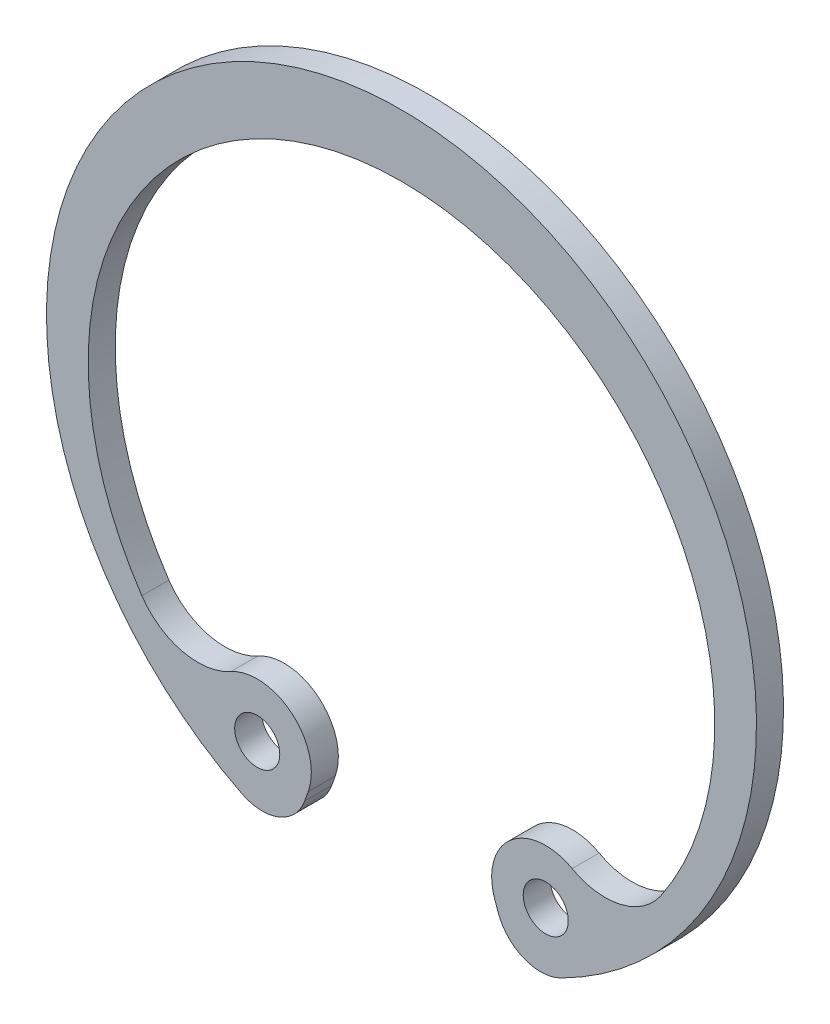
ISO-10303-21;
HEADER;
FILE_DESCRIPTION(('STEP AP214'),'2;1');
FILE_NAME('part.step','',(''),(''),'','','');
FILE_SCHEMA(('AUTOMOTIVE_DESIGN { 1 0 10303 214 1 1 1 1 }'));
ENDSEC;
DATA;
#1=APPLICATION_CONTEXT('core data for automotive mechanical design processes');
#2=APPLICATION_PROTOCOL_DEFINITION('international standard','automotive_design',2000,#1);
#3=PRODUCT_CONTEXT('',#1,'mechanical');
#4=PRODUCT('Part','Part','',(#3));
#5=PRODUCT_RELATED_PRODUCT_CATEGORY('part','',(#4));
#6=PRODUCT_DEFINITION_FORMATION('','',#4);
#7=PRODUCT_DEFINITION_CONTEXT('part definition',#1,'design');
#8=PRODUCT_DEFINITION('design','',#6,#7);
#9=PRODUCT_DEFINITION_SHAPE('','',#8);
#10=(LENGTH_UNIT() NAMED_UNIT(*) SI_UNIT(.MILLI.,.METRE.));
#11=(NAMED_UNIT(*) PLANE_ANGLE_UNIT() SI_UNIT($,.RADIAN.));
#12=(NAMED_UNIT(*) SI_UNIT($,.STERADIAN.) SOLID_ANGLE_UNIT());
#13=UNCERTAINTY_MEASURE_WITH_UNIT(LENGTH_MEASURE(1.E-05),#10,'distance_accuracy_value','');
#14=(GEOMETRIC_REPRESENTATION_CONTEXT(3) GLOBAL_UNCERTAINTY_ASSIGNED_CONTEXT((#13)) GLOBAL_UNIT_ASSIGNED_CONTEXT((#10,
#11,#12)) REPRESENTATION_CONTEXT('',''));
#15=CARTESIAN_POINT('',(0.,0.,0.));
#16=DIRECTION('',(0.,0.,1.));
#17=DIRECTION('',(1.,0.,0.));
#18=AXIS2_PLACEMENT_3D('',#15,#16,#17);
#19=CARTESIAN_POINT('',(-6.17774308325366,-11.384054314326,1.2));
#20=DIRECTION('',(0.,0.,1.));
#21=DIRECTION('',(1.,0.,0.));
#22=AXIS2_PLACEMENT_3D('',#19,#20,#21);
#23=PLANE('',#22);
#24=CARTESIAN_POINT('',(-6.4,-10.8159079887135,1.2));
#25=DIRECTION('',(0.,0.,1.));
#26=DIRECTION('',(1.,0.,0.));
#27=AXIS2_PLACEMENT_3D('',#24,#25,#26);
#28=CIRCLE('',#27,1.);
#29=CARTESIAN_POINT('',(-5.4,-10.8159079887135,1.2));
#30=VERTEX_POINT('',#29);
#31=EDGE_CURVE('E145',#30,#30,#28,.T.);
#32=ORIENTED_EDGE('',*,*,#31,.F.);
#33=EDGE_LOOP('',(#32));
#34=FACE_BOUND('',#33,.T.);
#35=CARTESIAN_POINT('',(-6.17774308325366,-11.384054314326,1.2));
#36=DIRECTION('',(0.,0.,1.));
#37=DIRECTION('',(1.,0.,0.));
#38=AXIS2_PLACEMENT_3D('',#35,#36,#37);
#39=CIRCLE('',#38,2.);
#40=CARTESIAN_POINT('',(-7.07632389536327,-13.1708258509553,1.2));
#41=VERTEX_POINT('',#40);
#42=CARTESIAN_POINT('',(-4.29368008749084,-12.0551032156717,1.2));
#43=VERTEX_POINT('',#42);
#44=EDGE_CURVE('E160',#41,#43,#39,.T.);
#45=ORIENTED_EDGE('',*,*,#44,.T.);
#46=DIRECTION('',(0.335524450672834,0.94203149788141,0.));
#47=VECTOR('',#46,1.);
#48=CARTESIAN_POINT('',(-4.13912440508462,-11.6211666703283,1.2));
#49=LINE('',#48,#47);
#50=CARTESIAN_POINT('',(-4.13912440508462,-11.6211666703283,1.2));
#51=VERTEX_POINT('',#50);
#52=EDGE_CURVE('E98',#43,#51,#49,.T.);
#53=ORIENTED_EDGE('',*,*,#52,.T.);
#54=CARTESIAN_POINT('',(-6.4,-10.8159079887135,1.2));
#55=DIRECTION('',(0.,0.,1.));
#56=DIRECTION('',(1.,0.,0.));
#57=AXIS2_PLACEMENT_3D('',#54,#55,#56);
#58=CIRCLE('',#57,2.4);
#59=CARTESIAN_POINT('',(-7.57002157304939,-8.72042486575613,1.2));
#60=VERTEX_POINT('',#59);
#61=EDGE_CURVE('E181',#51,#60,#58,.T.);
#62=ORIENTED_EDGE('',*,*,#61,.T.);
#63=CARTESIAN_POINT('',(-9.03254853936113,-6.10107096205946,1.2));
#64=DIRECTION('',(0.,0.,-1.));
#65=DIRECTION('',(1.,0.,0.));
#66=AXIS2_PLACEMENT_3D('',#63,#64,#65);
#67=CIRCLE('',#66,3.);
#68=CARTESIAN_POINT('',(-11.5185710731303,-7.78026480482811,1.2));
#69=VERTEX_POINT('',#68);
#70=EDGE_CURVE('E200',#60,#69,#67,.T.);
#71=ORIENTED_EDGE('',*,*,#70,.T.);
#72=CARTESIAN_POINT('',(0.,0.,1.2));
#73=DIRECTION('',(0.,0.,-1.));
#74=DIRECTION('',(1.,0.,0.));
#75=AXIS2_PLACEMENT_3D('',#72,#73,#74);
#76=CIRCLE('',#75,13.9);
#77=CARTESIAN_POINT('',(11.5185710731302,-7.78026480482812,1.2));
#78=VERTEX_POINT('',#77);
#79=EDGE_CURVE('E197',#69,#78,#76,.T.);
#80=ORIENTED_EDGE('',*,*,#79,.T.);
#81=CARTESIAN_POINT('',(9.03254853936113,-6.10107096205946,1.2));
#82=DIRECTION('',(0.,0.,-1.));
#83=DIRECTION('',(-1.,0.,0.));
#84=AXIS2_PLACEMENT_3D('',#81,#82,#83);
#85=CIRCLE('',#84,3.);
#86=CARTESIAN_POINT('',(7.57002157304939,-8.72042486575613,1.2));
#87=VERTEX_POINT('',#86);
#88=EDGE_CURVE('E199',#78,#87,#85,.T.);
#89=ORIENTED_EDGE('',*,*,#88,.T.);
#90=CARTESIAN_POINT('',(6.4,-10.8159079887135,1.2));
#91=DIRECTION('',(0.,0.,1.));
#92=DIRECTION('',(-1.,0.,0.));
#93=AXIS2_PLACEMENT_3D('',#90,#91,#92);
#94=CIRCLE('',#93,2.4);
#95=CARTESIAN_POINT('',(4.13912440508462,-11.6211666703283,1.2));
#96=VERTEX_POINT('',#95);
#97=EDGE_CURVE('E123',#87,#96,#94,.T.);
#98=ORIENTED_EDGE('',*,*,#97,.T.);
#99=DIRECTION('',(0.335524450672839,-0.942031497881408,0.));
#100=VECTOR('',#99,1.);
#101=CARTESIAN_POINT('',(4.13912440508462,-11.6211666703283,1.2));
#102=LINE('',#101,#100);
#103=CARTESIAN_POINT('',(4.29368008749084,-12.0551032156717,1.2));
#104=VERTEX_POINT('',#103);
#105=EDGE_CURVE('E117',#96,#104,#102,.T.);
#106=ORIENTED_EDGE('',*,*,#105,.T.);
#107=CARTESIAN_POINT('',(6.17774308325366,-11.384054314326,1.2));
#108=DIRECTION('',(0.,0.,1.));
#109=DIRECTION('',(-1.,0.,0.));
#110=AXIS2_PLACEMENT_3D('',#107,#108,#109);
#111=CIRCLE('',#110,2.);
#112=CARTESIAN_POINT('',(7.07632389536328,-13.1708258509553,1.2));
#113=VERTEX_POINT('',#112);
#114=EDGE_CURVE('E121',#104,#113,#111,.T.);
#115=ORIENTED_EDGE('',*,*,#114,.T.);
#116=CARTESIAN_POINT('',(0.,0.9,1.2));
#117=DIRECTION('',(0.,0.,1.));
#118=DIRECTION('',(-1.,0.,0.));
#119=AXIS2_PLACEMENT_3D('',#116,#117,#118);
#120=CIRCLE('',#119,15.75);
#121=EDGE_CURVE('E49',#113,#41,#120,.T.);
#122=ORIENTED_EDGE('',*,*,#121,.T.);
#123=EDGE_LOOP('',(#45,#53,#62,#71,#80,#89,#98,#106,#115,#122));
#124=FACE_BOUND('',#123,.T.);
#125=CARTESIAN_POINT('',(6.4,-10.8159079887135,1.2));
#126=DIRECTION('',(0.,0.,1.));
#127=DIRECTION('',(-1.,0.,0.));
#128=AXIS2_PLACEMENT_3D('',#125,#126,#127);
#129=CIRCLE('',#128,1.);
#130=CARTESIAN_POINT('',(5.4,-10.8159079887135,1.2));
#131=VERTEX_POINT('',#130);
#132=EDGE_CURVE('E211',#131,#131,#129,.T.);
#133=ORIENTED_EDGE('',*,*,#132,.F.);
#134=EDGE_LOOP('',(#133));
#135=FACE_BOUND('',#134,.T.);
#136=ADVANCED_FACE('F32',(#34,#124,#135),#23,.T.);
#137=CARTESIAN_POINT('',(-6.17774308325366,-11.384054314326,0.));
#138=DIRECTION('',(0.,0.,1.));
#139=DIRECTION('',(1.,0.,0.));
#140=AXIS2_PLACEMENT_3D('',#137,#138,#139);
#141=PLANE('',#140);
#142=CARTESIAN_POINT('',(-6.17774308325366,-11.384054314326,0.));
#143=DIRECTION('',(0.,0.,1.));
#144=DIRECTION('',(1.,0.,0.));
#145=AXIS2_PLACEMENT_3D('',#142,#143,#144);
#146=CIRCLE('',#145,2.);
#147=CARTESIAN_POINT('',(-7.07632389536327,-13.1708258509553,0.));
#148=VERTEX_POINT('',#147);
#149=CARTESIAN_POINT('',(-4.29368008749084,-12.0551032156717,0.));
#150=VERTEX_POINT('',#149);
#151=EDGE_CURVE('E141',#148,#150,#146,.T.);
#152=ORIENTED_EDGE('',*,*,#151,.F.);
#153=CARTESIAN_POINT('',(0.,0.9,0.));
#154=DIRECTION('',(0.,0.,1.));
#155=DIRECTION('',(-1.,0.,0.));
#156=AXIS2_PLACEMENT_3D('',#153,#154,#155);
#157=CIRCLE('',#156,15.75);
#158=CARTESIAN_POINT('',(7.07632389536328,-13.1708258509553,0.));
#159=VERTEX_POINT('',#158);
#160=EDGE_CURVE('E90',#159,#148,#157,.T.);
#161=ORIENTED_EDGE('',*,*,#160,.F.);
#162=CARTESIAN_POINT('',(6.17774308325366,-11.384054314326,0.));
#163=DIRECTION('',(0.,0.,1.));
#164=DIRECTION('',(-1.,0.,0.));
#165=AXIS2_PLACEMENT_3D('',#162,#163,#164);
#166=CIRCLE('',#165,2.);
#167=CARTESIAN_POINT('',(4.29368008749084,-12.0551032156717,0.));
#168=VERTEX_POINT('',#167);
#169=EDGE_CURVE('E84',#168,#159,#166,.T.);
#170=ORIENTED_EDGE('',*,*,#169,.F.);
#171=DIRECTION('',(0.335524450672839,-0.942031497881408,0.));
#172=VECTOR('',#171,1.);
#173=CARTESIAN_POINT('',(4.13912440508462,-11.6211666703283,0.));
#174=LINE('',#173,#172);
#175=CARTESIAN_POINT('',(4.13912440508462,-11.6211666703283,0.));
#176=VERTEX_POINT('',#175);
#177=EDGE_CURVE('E131',#176,#168,#174,.T.);
#178=ORIENTED_EDGE('',*,*,#177,.F.);
#179=CARTESIAN_POINT('',(6.4,-10.8159079887135,0.));
#180=DIRECTION('',(0.,0.,1.));
#181=DIRECTION('',(-1.,0.,0.));
#182=AXIS2_PLACEMENT_3D('',#179,#180,#181);
#183=CIRCLE('',#182,2.4);
#184=CARTESIAN_POINT('',(7.57002157304939,-8.72042486575613,0.));
#185=VERTEX_POINT('',#184);
#186=EDGE_CURVE('E155',#185,#176,#183,.T.);
#187=ORIENTED_EDGE('',*,*,#186,.F.);
#188=CARTESIAN_POINT('',(9.03254853936113,-6.10107096205946,0.));
#189=DIRECTION('',(0.,0.,-1.));
#190=DIRECTION('',(-1.,0.,0.));
#191=AXIS2_PLACEMENT_3D('',#188,#189,#190);
#192=CIRCLE('',#191,3.);
#193=CARTESIAN_POINT('',(11.5185710731302,-7.78026480482812,0.));
#194=VERTEX_POINT('',#193);
#195=EDGE_CURVE('E153',#194,#185,#192,.T.);
#196=ORIENTED_EDGE('',*,*,#195,.F.);
#197=CARTESIAN_POINT('',(0.,0.,0.));
#198=DIRECTION('',(0.,0.,-1.));
#199=DIRECTION('',(1.,0.,0.));
#200=AXIS2_PLACEMENT_3D('',#197,#198,#199);
#201=CIRCLE('',#200,13.9);
#202=CARTESIAN_POINT('',(-11.5185710731303,-7.78026480482811,0.));
#203=VERTEX_POINT('',#202);
#204=EDGE_CURVE('E151',#203,#194,#201,.T.);
#205=ORIENTED_EDGE('',*,*,#204,.F.);
#206=CARTESIAN_POINT('',(-9.03254853936113,-6.10107096205946,0.));
#207=DIRECTION('',(0.,0.,-1.));
#208=DIRECTION('',(1.,0.,0.));
#209=AXIS2_PLACEMENT_3D('',#206,#207,#208);
#210=CIRCLE('',#209,3.);
#211=CARTESIAN_POINT('',(-7.57002157304939,-8.72042486575613,0.));
#212=VERTEX_POINT('',#211);
#213=EDGE_CURVE('E149',#212,#203,#210,.T.);
#214=ORIENTED_EDGE('',*,*,#213,.F.);
#215=CARTESIAN_POINT('',(-6.4,-10.8159079887135,0.));
#216=DIRECTION('',(0.,0.,1.));
#217=DIRECTION('',(1.,0.,0.));
#218=AXIS2_PLACEMENT_3D('',#215,#216,#217);
#219=CIRCLE('',#218,2.4);
#220=CARTESIAN_POINT('',(-4.13912440508462,-11.6211666703283,0.));
#221=VERTEX_POINT('',#220);
#222=EDGE_CURVE('E147',#221,#212,#219,.T.);
#223=ORIENTED_EDGE('',*,*,#222,.F.);
#224=DIRECTION('',(0.335524450672834,0.94203149788141,0.));
#225=VECTOR('',#224,1.);
#226=CARTESIAN_POINT('',(-4.13912440508462,-11.6211666703283,0.));
#227=LINE('',#226,#225);
#228=EDGE_CURVE('E144',#150,#221,#227,.T.);
#229=ORIENTED_EDGE('',*,*,#228,.F.);
#230=EDGE_LOOP('',(#152,#161,#170,#178,#187,#196,#205,#214,#223,#229));
#231=FACE_BOUND('',#230,.T.);
#232=CARTESIAN_POINT('',(-6.4,-10.8159079887135,0.));
#233=DIRECTION('',(0.,0.,1.));
#234=DIRECTION('',(1.,0.,0.));
#235=AXIS2_PLACEMENT_3D('',#232,#233,#234);
#236=CIRCLE('',#235,1.);
#237=CARTESIAN_POINT('',(-5.4,-10.8159079887135,0.));
#238=VERTEX_POINT('',#237);
#239=EDGE_CURVE('E208',#238,#238,#236,.T.);
#240=ORIENTED_EDGE('',*,*,#239,.T.);
#241=EDGE_LOOP('',(#240));
#242=FACE_BOUND('',#241,.T.);
#243=CARTESIAN_POINT('',(6.4,-10.8159079887135,0.));
#244=DIRECTION('',(0.,0.,1.));
#245=DIRECTION('',(-1.,0.,0.));
#246=AXIS2_PLACEMENT_3D('',#243,#244,#245);
#247=CIRCLE('',#246,1.);
#248=CARTESIAN_POINT('',(5.4,-10.8159079887135,0.));
#249=VERTEX_POINT('',#248);
#250=EDGE_CURVE('E214',#249,#249,#247,.T.);
#251=ORIENTED_EDGE('',*,*,#250,.T.);
#252=EDGE_LOOP('',(#251));
#253=FACE_BOUND('',#252,.T.);
#254=ADVANCED_FACE('F185',(#231,#242,#253),#141,.F.);
#255=CARTESIAN_POINT('',(-6.17774308325366,-11.384054314326,1.2));
#256=DIRECTION('',(0.,0.,-1.));
#257=DIRECTION('',(-1.,0.,0.));
#258=AXIS2_PLACEMENT_3D('',#255,#256,#257);
#259=CYLINDRICAL_SURFACE('',#258,2.);
#260=ORIENTED_EDGE('',*,*,#151,.T.);
#261=DIRECTION('',(0.,0.,-1.));
#262=VECTOR('',#261,1.);
#263=CARTESIAN_POINT('',(-4.29368008749084,-12.0551032156717,1.2));
#264=LINE('',#263,#262);
#265=EDGE_CURVE('E11',#43,#150,#264,.T.);
#266=ORIENTED_EDGE('',*,*,#265,.F.);
#267=ORIENTED_EDGE('',*,*,#44,.F.);
#268=DIRECTION('',(0.,0.,-1.));
#269=VECTOR('',#268,1.);
#270=CARTESIAN_POINT('',(-7.07632389536327,-13.1708258509553,1.2));
#271=LINE('',#270,#269);
#272=EDGE_CURVE('E137',#41,#148,#271,.T.);
#273=ORIENTED_EDGE('',*,*,#272,.T.);
#274=EDGE_LOOP('',(#260,#266,#267,#273));
#275=FACE_BOUND('',#274,.T.);
#276=ADVANCED_FACE('F34',(#275),#259,.T.);
#277=CARTESIAN_POINT('',(-4.13912440508462,-11.6211666703283,1.2));
#278=DIRECTION('',(-0.94203149788141,0.335524450672834,0.));
#279=DIRECTION('',(-0.335524450672834,-0.94203149788141,0.));
#280=AXIS2_PLACEMENT_3D('',#277,#278,#279);
#281=PLANE('',#280);
#282=ORIENTED_EDGE('',*,*,#228,.T.);
#283=DIRECTION('',(0.,0.,-1.));
#284=VECTOR('',#283,1.);
#285=CARTESIAN_POINT('',(-4.13912440508462,-11.6211666703283,1.2));
#286=LINE('',#285,#284);
#287=EDGE_CURVE('E41',#51,#221,#286,.T.);
#288=ORIENTED_EDGE('',*,*,#287,.F.);
#289=ORIENTED_EDGE('',*,*,#52,.F.);
#290=ORIENTED_EDGE('',*,*,#265,.T.);
#291=EDGE_LOOP('',(#282,#288,#289,#290));
#292=FACE_BOUND('',#291,.T.);
#293=ADVANCED_FACE('F254',(#292),#281,.F.);
#294=CARTESIAN_POINT('',(-6.4,-10.8159079887135,1.2));
#295=DIRECTION('',(0.,0.,-1.));
#296=DIRECTION('',(-1.,0.,0.));
#297=AXIS2_PLACEMENT_3D('',#294,#295,#296);
#298=CYLINDRICAL_SURFACE('',#297,2.4);
#299=ORIENTED_EDGE('',*,*,#222,.T.);
#300=DIRECTION('',(0.,0.,-1.));
#301=VECTOR('',#300,1.);
#302=CARTESIAN_POINT('',(-7.57002157304939,-8.72042486575613,1.2));
#303=LINE('',#302,#301);
#304=EDGE_CURVE('E173',#60,#212,#303,.T.);
#305=ORIENTED_EDGE('',*,*,#304,.F.);
#306=ORIENTED_EDGE('',*,*,#61,.F.);
#307=ORIENTED_EDGE('',*,*,#287,.T.);
#308=EDGE_LOOP('',(#299,#305,#306,#307));
#309=FACE_BOUND('',#308,.T.);
#310=ADVANCED_FACE('F179',(#309),#298,.T.);
#311=CARTESIAN_POINT('',(-9.03254853936113,-6.10107096205946,1.2));
#312=DIRECTION('',(0.,0.,-1.));
#313=DIRECTION('',(-1.,0.,0.));
#314=AXIS2_PLACEMENT_3D('',#311,#312,#313);
#315=CYLINDRICAL_SURFACE('',#314,3.);
#316=ORIENTED_EDGE('',*,*,#213,.T.);
#317=DIRECTION('',(0.,0.,-1.));
#318=VECTOR('',#317,1.);
#319=CARTESIAN_POINT('',(-11.5185710731303,-7.78026480482811,1.2));
#320=LINE('',#319,#318);
#321=EDGE_CURVE('E170',#69,#203,#320,.T.);
#322=ORIENTED_EDGE('',*,*,#321,.F.);
#323=ORIENTED_EDGE('',*,*,#70,.F.);
#324=ORIENTED_EDGE('',*,*,#304,.T.);
#325=EDGE_LOOP('',(#316,#322,#323,#324));
#326=FACE_BOUND('',#325,.T.);
#327=ADVANCED_FACE('F191',(#326),#315,.F.);
#328=CARTESIAN_POINT('',(0.,0.,1.2));
#329=DIRECTION('',(0.,0.,-1.));
#330=DIRECTION('',(-1.,0.,0.));
#331=AXIS2_PLACEMENT_3D('',#328,#329,#330);
#332=CYLINDRICAL_SURFACE('',#331,13.9);
#333=ORIENTED_EDGE('',*,*,#204,.T.);
#334=DIRECTION('',(0.,0.,-1.));
#335=VECTOR('',#334,1.);
#336=CARTESIAN_POINT('',(11.5185710731302,-7.78026480482812,1.2));
#337=LINE('',#336,#335);
#338=EDGE_CURVE('E167',#78,#194,#337,.T.);
#339=ORIENTED_EDGE('',*,*,#338,.F.);
#340=ORIENTED_EDGE('',*,*,#79,.F.);
#341=ORIENTED_EDGE('',*,*,#321,.T.);
#342=EDGE_LOOP('',(#333,#339,#340,#341));
#343=FACE_BOUND('',#342,.T.);
#344=ADVANCED_FACE('F195',(#343),#332,.F.);
#345=CARTESIAN_POINT('',(9.03254853936113,-6.10107096205946,1.2));
#346=DIRECTION('',(0.,0.,-1.));
#347=DIRECTION('',(-1.,0.,0.));
#348=AXIS2_PLACEMENT_3D('',#345,#346,#347);
#349=CYLINDRICAL_SURFACE('',#348,3.);
#350=ORIENTED_EDGE('',*,*,#195,.T.);
#351=DIRECTION('',(0.,0.,-1.));
#352=VECTOR('',#351,1.);
#353=CARTESIAN_POINT('',(7.57002157304939,-8.72042486575613,1.2));
#354=LINE('',#353,#352);
#355=EDGE_CURVE('E164',#87,#185,#354,.T.);
#356=ORIENTED_EDGE('',*,*,#355,.F.);
#357=ORIENTED_EDGE('',*,*,#88,.F.);
#358=ORIENTED_EDGE('',*,*,#338,.T.);
#359=EDGE_LOOP('',(#350,#356,#357,#358));
#360=FACE_BOUND('',#359,.T.);
#361=ADVANCED_FACE('F244',(#360),#349,.F.);
#362=CARTESIAN_POINT('',(6.4,-10.8159079887135,1.2));
#363=DIRECTION('',(0.,0.,-1.));
#364=DIRECTION('',(-1.,0.,0.));
#365=AXIS2_PLACEMENT_3D('',#362,#363,#364);
#366=CYLINDRICAL_SURFACE('',#365,2.4);
#367=ORIENTED_EDGE('',*,*,#186,.T.);
#368=DIRECTION('',(0.,0.,-1.));
#369=VECTOR('',#368,1.);
#370=CARTESIAN_POINT('',(4.13912440508462,-11.6211666703283,1.2));
#371=LINE('',#370,#369);
#372=EDGE_CURVE('E132',#96,#176,#371,.T.);
#373=ORIENTED_EDGE('',*,*,#372,.F.);
#374=ORIENTED_EDGE('',*,*,#97,.F.);
#375=ORIENTED_EDGE('',*,*,#355,.T.);
#376=EDGE_LOOP('',(#367,#373,#374,#375));
#377=FACE_BOUND('',#376,.T.);
#378=ADVANCED_FACE('F241',(#377),#366,.T.);
#379=CARTESIAN_POINT('',(4.13912440508462,-11.6211666703283,1.2));
#380=DIRECTION('',(0.942031497881408,0.335524450672839,0.));
#381=DIRECTION('',(-0.335524450672839,0.942031497881408,0.));
#382=AXIS2_PLACEMENT_3D('',#379,#380,#381);
#383=PLANE('',#382);
#384=ORIENTED_EDGE('',*,*,#177,.T.);
#385=DIRECTION('',(0.,0.,-1.));
#386=VECTOR('',#385,1.);
#387=CARTESIAN_POINT('',(4.29368008749084,-12.0551032156717,1.2));
#388=LINE('',#387,#386);
#389=EDGE_CURVE('E128',#104,#168,#388,.T.);
#390=ORIENTED_EDGE('',*,*,#389,.F.);
#391=ORIENTED_EDGE('',*,*,#105,.F.);
#392=ORIENTED_EDGE('',*,*,#372,.T.);
#393=EDGE_LOOP('',(#384,#390,#391,#392));
#394=FACE_BOUND('',#393,.T.);
#395=ADVANCED_FACE('F129',(#394),#383,.F.);
#396=CARTESIAN_POINT('',(6.17774308325366,-11.384054314326,1.2));
#397=DIRECTION('',(0.,0.,-1.));
#398=DIRECTION('',(-1.,0.,0.));
#399=AXIS2_PLACEMENT_3D('',#396,#397,#398);
#400=CYLINDRICAL_SURFACE('',#399,2.);
#401=ORIENTED_EDGE('',*,*,#169,.T.);
#402=DIRECTION('',(0.,0.,-1.));
#403=VECTOR('',#402,1.);
#404=CARTESIAN_POINT('',(7.07632389536328,-13.1708258509553,1.2));
#405=LINE('',#404,#403);
#406=EDGE_CURVE('E133',#113,#159,#405,.T.);
#407=ORIENTED_EDGE('',*,*,#406,.F.);
#408=ORIENTED_EDGE('',*,*,#114,.F.);
#409=ORIENTED_EDGE('',*,*,#389,.T.);
#410=EDGE_LOOP('',(#401,#407,#408,#409));
#411=FACE_BOUND('',#410,.T.);
#412=ADVANCED_FACE('F135',(#411),#400,.T.);
#413=CARTESIAN_POINT('',(0.,0.9,1.2));
#414=DIRECTION('',(0.,0.,-1.));
#415=DIRECTION('',(-1.,0.,0.));
#416=AXIS2_PLACEMENT_3D('',#413,#414,#415);
#417=CYLINDRICAL_SURFACE('',#416,15.75);
#418=ORIENTED_EDGE('',*,*,#160,.T.);
#419=ORIENTED_EDGE('',*,*,#272,.F.);
#420=ORIENTED_EDGE('',*,*,#121,.F.);
#421=ORIENTED_EDGE('',*,*,#406,.T.);
#422=EDGE_LOOP('',(#418,#419,#420,#421));
#423=FACE_BOUND('',#422,.T.);
#424=ADVANCED_FACE('F234',(#423),#417,.T.);
#425=CARTESIAN_POINT('',(-6.4,-10.8159079887135,1.2));
#426=DIRECTION('',(0.,0.,-1.));
#427=DIRECTION('',(-1.,0.,0.));
#428=AXIS2_PLACEMENT_3D('',#425,#426,#427);
#429=CYLINDRICAL_SURFACE('',#428,1.);
#430=ORIENTED_EDGE('',*,*,#31,.T.);
#431=EDGE_LOOP('',(#430));
#432=FACE_BOUND('',#431,.T.);
#433=ORIENTED_EDGE('',*,*,#239,.F.);
#434=EDGE_LOOP('',(#433));
#435=FACE_BOUND('',#434,.T.);
#436=ADVANCED_FACE('F231',(#432,#435),#429,.F.);
#437=CARTESIAN_POINT('',(6.4,-10.8159079887135,1.2));
#438=DIRECTION('',(0.,0.,-1.));
#439=DIRECTION('',(-1.,0.,0.));
#440=AXIS2_PLACEMENT_3D('',#437,#438,#439);
#441=CYLINDRICAL_SURFACE('',#440,1.);
#442=ORIENTED_EDGE('',*,*,#132,.T.);
#443=EDGE_LOOP('',(#442));
#444=FACE_BOUND('',#443,.T.);
#445=ORIENTED_EDGE('',*,*,#250,.F.);
#446=EDGE_LOOP('',(#445));
#447=FACE_BOUND('',#446,.T.);
#448=ADVANCED_FACE('F220',(#444,#447),#441,.F.);
#449=CLOSED_SHELL('',(#136,#254,#276,#293,#310,#327,#344,#361,#378,#395,#412,#424,#436,#448));
#450=MANIFOLD_SOLID_BREP('B2',#449);
#451=ADVANCED_BREP_SHAPE_REPRESENTATION('',(#18,#450),#14);
#452=SHAPE_DEFINITION_REPRESENTATION(#9,#451);
ENDSEC;
END-ISO-10303-21;
